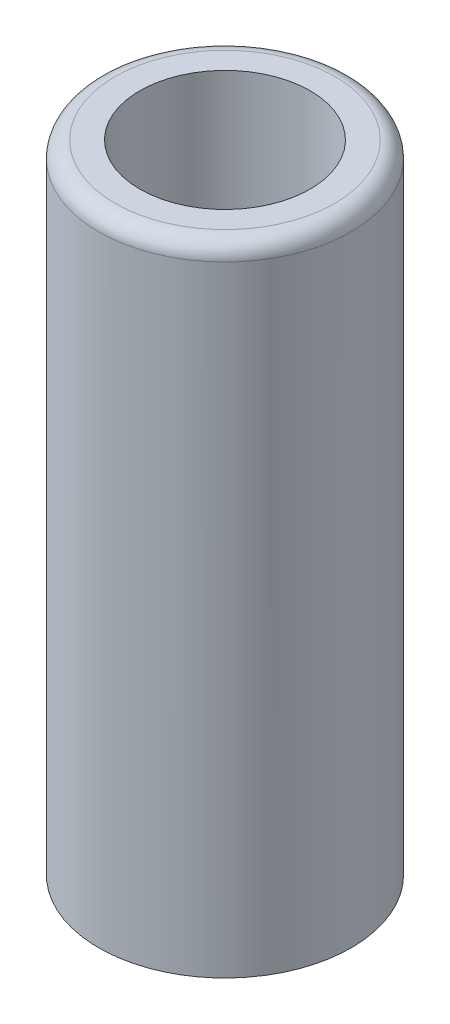
ISO-10303-21;
HEADER;
FILE_DESCRIPTION(('STEP AP214'),'2;1');
FILE_NAME('part.step','',(''),(''),'','','');
FILE_SCHEMA(('AUTOMOTIVE_DESIGN { 1 0 10303 214 1 1 1 1 }'));
ENDSEC;
DATA;
#1=APPLICATION_CONTEXT('core data for automotive mechanical design processes');
#2=APPLICATION_PROTOCOL_DEFINITION('international standard','automotive_design',2000,#1);
#3=PRODUCT_CONTEXT('',#1,'mechanical');
#4=PRODUCT('Part','Part','',(#3));
#5=PRODUCT_RELATED_PRODUCT_CATEGORY('part','',(#4));
#6=PRODUCT_DEFINITION_FORMATION('','',#4);
#7=PRODUCT_DEFINITION_CONTEXT('part definition',#1,'design');
#8=PRODUCT_DEFINITION('design','',#6,#7);
#9=PRODUCT_DEFINITION_SHAPE('','',#8);
#10=(LENGTH_UNIT() NAMED_UNIT(*) SI_UNIT(.MILLI.,.METRE.));
#11=(NAMED_UNIT(*) PLANE_ANGLE_UNIT() SI_UNIT($,.RADIAN.));
#12=(NAMED_UNIT(*) SI_UNIT($,.STERADIAN.) SOLID_ANGLE_UNIT());
#13=UNCERTAINTY_MEASURE_WITH_UNIT(LENGTH_MEASURE(1.E-05),#10,'distance_accuracy_value','');
#14=(GEOMETRIC_REPRESENTATION_CONTEXT(3) GLOBAL_UNCERTAINTY_ASSIGNED_CONTEXT((#13)) GLOBAL_UNIT_ASSIGNED_CONTEXT((#10,
#11,#12)) REPRESENTATION_CONTEXT('',''));
#15=CARTESIAN_POINT('',(0.,0.,0.));
#16=DIRECTION('',(0.,0.,1.));
#17=DIRECTION('',(1.,0.,0.));
#18=AXIS2_PLACEMENT_3D('',#15,#16,#17);
#19=CARTESIAN_POINT('',(0.,25.,0.));
#20=DIRECTION('',(0.,1.,0.));
#21=DIRECTION('',(0.,0.,1.));
#22=AXIS2_PLACEMENT_3D('',#19,#20,#21);
#23=PLANE('',#22);
#24=CARTESIAN_POINT('',(0.,25.,0.));
#25=DIRECTION('',(0.,1.,0.));
#26=DIRECTION('',(0.,0.,1.));
#27=AXIS2_PLACEMENT_3D('',#24,#25,#26);
#28=CIRCLE('',#27,13.375);
#29=CARTESIAN_POINT('',(0.,25.,13.375));
#30=VERTEX_POINT('',#29);
#31=EDGE_CURVE('E55',#30,#30,#28,.T.);
#32=ORIENTED_EDGE('',*,*,#31,.T.);
#33=EDGE_LOOP('',(#32));
#34=FACE_BOUND('',#33,.T.);
#35=CARTESIAN_POINT('',(0.,25.,0.));
#36=DIRECTION('',(0.,1.,0.));
#37=DIRECTION('',(0.,0.,1.));
#38=AXIS2_PLACEMENT_3D('',#35,#36,#37);
#39=CIRCLE('',#38,10.375);
#40=CARTESIAN_POINT('',(0.,25.,10.375));
#41=VERTEX_POINT('',#40);
#42=EDGE_CURVE('E61',#41,#41,#39,.T.);
#43=ORIENTED_EDGE('',*,*,#42,.F.);
#44=EDGE_LOOP('',(#43));
#45=FACE_BOUND('',#44,.T.);
#46=ADVANCED_FACE('F37',(#34,#45),#23,.T.);
#47=CARTESIAN_POINT('',(0.,25.,0.));
#48=DIRECTION('',(0.,-1.,0.));
#49=DIRECTION('',(0.,0.,-1.));
#50=AXIS2_PLACEMENT_3D('',#47,#48,#49);
#51=CYLINDRICAL_SURFACE('',#50,15.375);
#52=CARTESIAN_POINT('',(0.,23.,0.));
#53=DIRECTION('',(0.,1.,0.));
#54=DIRECTION('',(0.,0.,1.));
#55=AXIS2_PLACEMENT_3D('',#52,#53,#54);
#56=CIRCLE('',#55,15.375);
#57=CARTESIAN_POINT('',(0.,23.,15.375));
#58=VERTEX_POINT('',#57);
#59=EDGE_CURVE('E50',#58,#58,#56,.F.);
#60=ORIENTED_EDGE('',*,*,#59,.T.);
#61=EDGE_LOOP('',(#60));
#62=FACE_BOUND('',#61,.T.);
#63=CARTESIAN_POINT('',(0.,-52.5,0.));
#64=DIRECTION('',(0.,-1.,0.));
#65=DIRECTION('',(0.,0.,-1.));
#66=AXIS2_PLACEMENT_3D('',#63,#64,#65);
#67=CIRCLE('',#66,15.375);
#68=CARTESIAN_POINT('',(0.,-52.5,-15.375));
#69=VERTEX_POINT('',#68);
#70=EDGE_CURVE('E65',#69,#69,#67,.T.);
#71=ORIENTED_EDGE('',*,*,#70,.F.);
#72=EDGE_LOOP('',(#71));
#73=FACE_BOUND('',#72,.T.);
#74=ADVANCED_FACE('F72',(#62,#73),#51,.T.);
#75=CARTESIAN_POINT('',(0.,25.,0.));
#76=DIRECTION('',(0.,-1.,0.));
#77=DIRECTION('',(0.,0.,-1.));
#78=AXIS2_PLACEMENT_3D('',#75,#76,#77);
#79=CYLINDRICAL_SURFACE('',#78,10.375);
#80=CARTESIAN_POINT('',(0.,2.,0.));
#81=DIRECTION('',(0.,-1.,0.));
#82=DIRECTION('',(0.,0.,-1.));
#83=AXIS2_PLACEMENT_3D('',#80,#81,#82);
#84=CIRCLE('',#83,10.375);
#85=CARTESIAN_POINT('',(0.,2.,-10.375));
#86=VERTEX_POINT('',#85);
#87=EDGE_CURVE('E10',#86,#86,#84,.T.);
#88=ORIENTED_EDGE('',*,*,#87,.T.);
#89=EDGE_LOOP('',(#88));
#90=FACE_BOUND('',#89,.T.);
#91=ORIENTED_EDGE('',*,*,#42,.T.);
#92=EDGE_LOOP('',(#91));
#93=FACE_BOUND('',#92,.T.);
#94=ADVANCED_FACE('F74',(#90,#93),#79,.F.);
#95=CARTESIAN_POINT('',(0.,0.,0.));
#96=DIRECTION('',(0.,-1.,0.));
#97=DIRECTION('',(0.,0.,-1.));
#98=AXIS2_PLACEMENT_3D('',#95,#96,#97);
#99=PLANE('',#98);
#100=CARTESIAN_POINT('',(0.,0.,0.));
#101=DIRECTION('',(0.,-1.,0.));
#102=DIRECTION('',(0.,0.,-1.));
#103=AXIS2_PLACEMENT_3D('',#100,#101,#102);
#104=CIRCLE('',#103,8.375);
#105=CARTESIAN_POINT('',(0.,0.,-8.375));
#106=VERTEX_POINT('',#105);
#107=EDGE_CURVE('E45',#106,#106,#104,.F.);
#108=ORIENTED_EDGE('',*,*,#107,.T.);
#109=EDGE_LOOP('',(#108));
#110=FACE_BOUND('',#109,.T.);
#111=ADVANCED_FACE('F81',(#110),#99,.F.);
#112=CARTESIAN_POINT('',(0.,-52.5,0.));
#113=DIRECTION('',(0.,-1.,0.));
#114=DIRECTION('',(0.,0.,-1.));
#115=AXIS2_PLACEMENT_3D('',#112,#113,#114);
#116=PLANE('',#115);
#117=ORIENTED_EDGE('',*,*,#70,.T.);
#118=EDGE_LOOP('',(#117));
#119=FACE_BOUND('',#118,.T.);
#120=ADVANCED_FACE('F70',(#119),#116,.T.);
#121=CARTESIAN_POINT('',(0.,23.,0.));
#122=DIRECTION('',(0.,1.,0.));
#123=DIRECTION('',(0.,0.,1.));
#124=AXIS2_PLACEMENT_3D('',#121,#122,#123);
#125=TOROIDAL_SURFACE('',#124,13.375,2.);
#126=ORIENTED_EDGE('',*,*,#59,.F.);
#127=EDGE_LOOP('',(#126));
#128=FACE_BOUND('',#127,.T.);
#129=ORIENTED_EDGE('',*,*,#31,.F.);
#130=EDGE_LOOP('',(#129));
#131=FACE_BOUND('',#130,.T.);
#132=ADVANCED_FACE('F85',(#128,#131),#125,.T.);
#133=CARTESIAN_POINT('',(0.,2.,0.));
#134=DIRECTION('',(0.,-1.,0.));
#135=DIRECTION('',(0.,0.,-1.));
#136=AXIS2_PLACEMENT_3D('',#133,#134,#135);
#137=TOROIDAL_SURFACE('',#136,8.375,2.);
#138=ORIENTED_EDGE('',*,*,#87,.F.);
#139=EDGE_LOOP('',(#138));
#140=FACE_BOUND('',#139,.T.);
#141=ORIENTED_EDGE('',*,*,#107,.F.);
#142=EDGE_LOOP('',(#141));
#143=FACE_BOUND('',#142,.T.);
#144=ADVANCED_FACE('F39',(#140,#143),#137,.F.);
#145=CLOSED_SHELL('',(#46,#74,#94,#111,#120,#132,#144));
#146=MANIFOLD_SOLID_BREP('B2',#145);
#147=ADVANCED_BREP_SHAPE_REPRESENTATION('',(#18,#146),#14);
#148=SHAPE_DEFINITION_REPRESENTATION(#9,#147);
ENDSEC;
END-ISO-10303-21;
